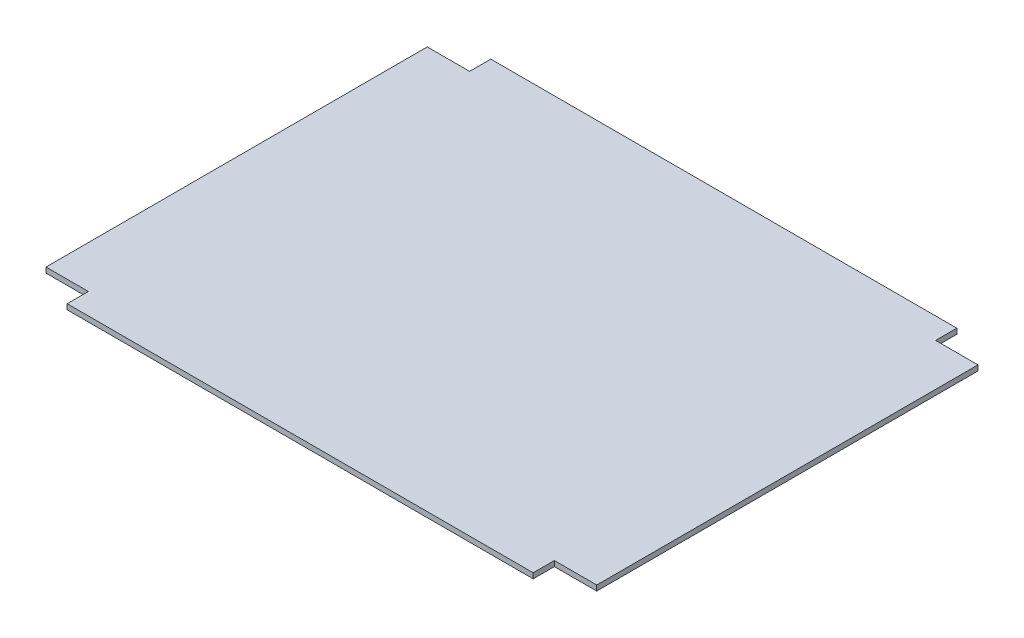
ISO-10303-21;
HEADER;
FILE_DESCRIPTION(('STEP AP214'),'2;1');
FILE_NAME('part.step','',(''),(''),'','','');
FILE_SCHEMA(('AUTOMOTIVE_DESIGN { 1 0 10303 214 1 1 1 1 }'));
ENDSEC;
DATA;
#1=APPLICATION_CONTEXT('core data for automotive mechanical design processes');
#2=APPLICATION_PROTOCOL_DEFINITION('international standard','automotive_design',2000,#1);
#3=PRODUCT_CONTEXT('',#1,'mechanical');
#4=PRODUCT('Part','Part','',(#3));
#5=PRODUCT_RELATED_PRODUCT_CATEGORY('part','',(#4));
#6=PRODUCT_DEFINITION_FORMATION('','',#4);
#7=PRODUCT_DEFINITION_CONTEXT('part definition',#1,'design');
#8=PRODUCT_DEFINITION('design','',#6,#7);
#9=PRODUCT_DEFINITION_SHAPE('','',#8);
#10=(LENGTH_UNIT() NAMED_UNIT(*) SI_UNIT(.MILLI.,.METRE.));
#11=(NAMED_UNIT(*) PLANE_ANGLE_UNIT() SI_UNIT($,.RADIAN.));
#12=(NAMED_UNIT(*) SI_UNIT($,.STERADIAN.) SOLID_ANGLE_UNIT());
#13=UNCERTAINTY_MEASURE_WITH_UNIT(LENGTH_MEASURE(1.E-05),#10,'distance_accuracy_value','');
#14=(GEOMETRIC_REPRESENTATION_CONTEXT(3) GLOBAL_UNCERTAINTY_ASSIGNED_CONTEXT((#13)) GLOBAL_UNIT_ASSIGNED_CONTEXT((#10,
#11,#12)) REPRESENTATION_CONTEXT('',''));
#15=CARTESIAN_POINT('',(0.,0.,0.));
#16=DIRECTION('',(0.,0.,1.));
#17=DIRECTION('',(1.,0.,0.));
#18=AXIS2_PLACEMENT_3D('',#15,#16,#17);
#19=CARTESIAN_POINT('',(-520.,10.,360.));
#20=DIRECTION('',(1.,0.,0.));
#21=DIRECTION('',(0.,0.,-1.));
#22=AXIS2_PLACEMENT_3D('',#19,#20,#21);
#23=PLANE('',#22);
#24=DIRECTION('',(0.,0.,1.));
#25=VECTOR('',#24,1.);
#26=CARTESIAN_POINT('',(-520.,0.,360.));
#27=LINE('',#26,#25);
#28=CARTESIAN_POINT('',(-520.,0.,-360.));
#29=VERTEX_POINT('',#28);
#30=CARTESIAN_POINT('',(-520.,0.,360.));
#31=VERTEX_POINT('',#30);
#32=EDGE_CURVE('E208',#29,#31,#27,.T.);
#33=ORIENTED_EDGE('',*,*,#32,.T.);
#34=DIRECTION('',(0.,-1.,0.));
#35=VECTOR('',#34,1.);
#36=CARTESIAN_POINT('',(-520.,10.,360.));
#37=LINE('',#36,#35);
#38=CARTESIAN_POINT('',(-520.,10.,360.));
#39=VERTEX_POINT('',#38);
#40=EDGE_CURVE('E11',#39,#31,#37,.T.);
#41=ORIENTED_EDGE('',*,*,#40,.F.);
#42=DIRECTION('',(0.,0.,1.));
#43=VECTOR('',#42,1.);
#44=CARTESIAN_POINT('',(-520.,10.,360.));
#45=LINE('',#44,#43);
#46=CARTESIAN_POINT('',(-520.,10.,-360.));
#47=VERTEX_POINT('',#46);
#48=EDGE_CURVE('E73',#47,#39,#45,.T.);
#49=ORIENTED_EDGE('',*,*,#48,.F.);
#50=DIRECTION('',(0.,-1.,0.));
#51=VECTOR('',#50,1.);
#52=CARTESIAN_POINT('',(-520.,10.,-360.));
#53=LINE('',#52,#51);
#54=EDGE_CURVE('E195',#47,#29,#53,.T.);
#55=ORIENTED_EDGE('',*,*,#54,.T.);
#56=EDGE_LOOP('',(#33,#41,#49,#55));
#57=FACE_BOUND('',#56,.T.);
#58=ADVANCED_FACE('F33',(#57),#23,.F.);
#59=CARTESIAN_POINT('',(-440.,10.,360.));
#60=DIRECTION('',(0.,0.,-1.));
#61=DIRECTION('',(-1.,0.,0.));
#62=AXIS2_PLACEMENT_3D('',#59,#60,#61);
#63=PLANE('',#62);
#64=DIRECTION('',(1.,0.,0.));
#65=VECTOR('',#64,1.);
#66=CARTESIAN_POINT('',(-440.,0.,360.));
#67=LINE('',#66,#65);
#68=CARTESIAN_POINT('',(-440.,0.,360.));
#69=VERTEX_POINT('',#68);
#70=EDGE_CURVE('E63',#31,#69,#67,.T.);
#71=ORIENTED_EDGE('',*,*,#70,.T.);
#72=DIRECTION('',(0.,-1.,0.));
#73=VECTOR('',#72,1.);
#74=CARTESIAN_POINT('',(-440.,10.,360.));
#75=LINE('',#74,#73);
#76=CARTESIAN_POINT('',(-440.,10.,360.));
#77=VERTEX_POINT('',#76);
#78=EDGE_CURVE('E41',#77,#69,#75,.T.);
#79=ORIENTED_EDGE('',*,*,#78,.F.);
#80=DIRECTION('',(1.,0.,0.));
#81=VECTOR('',#80,1.);
#82=CARTESIAN_POINT('',(-440.,10.,360.));
#83=LINE('',#82,#81);
#84=EDGE_CURVE('E210',#39,#77,#83,.T.);
#85=ORIENTED_EDGE('',*,*,#84,.F.);
#86=ORIENTED_EDGE('',*,*,#40,.T.);
#87=EDGE_LOOP('',(#71,#79,#85,#86));
#88=FACE_BOUND('',#87,.T.);
#89=ADVANCED_FACE('F250',(#88),#63,.F.);
#90=CARTESIAN_POINT('',(-440.,10.,400.));
#91=DIRECTION('',(1.,0.,0.));
#92=DIRECTION('',(0.,0.,-1.));
#93=AXIS2_PLACEMENT_3D('',#90,#91,#92);
#94=PLANE('',#93);
#95=DIRECTION('',(0.,0.,1.));
#96=VECTOR('',#95,1.);
#97=CARTESIAN_POINT('',(-440.,0.,400.));
#98=LINE('',#97,#96);
#99=CARTESIAN_POINT('',(-440.,0.,400.));
#100=VERTEX_POINT('',#99);
#101=EDGE_CURVE('E68',#69,#100,#98,.T.);
#102=ORIENTED_EDGE('',*,*,#101,.T.);
#103=DIRECTION('',(0.,-1.,0.));
#104=VECTOR('',#103,1.);
#105=CARTESIAN_POINT('',(-440.,10.,400.));
#106=LINE('',#105,#104);
#107=CARTESIAN_POINT('',(-440.,10.,400.));
#108=VERTEX_POINT('',#107);
#109=EDGE_CURVE('E136',#108,#100,#106,.T.);
#110=ORIENTED_EDGE('',*,*,#109,.F.);
#111=DIRECTION('',(0.,0.,1.));
#112=VECTOR('',#111,1.);
#113=CARTESIAN_POINT('',(-440.,10.,400.));
#114=LINE('',#113,#112);
#115=EDGE_CURVE('E49',#77,#108,#114,.T.);
#116=ORIENTED_EDGE('',*,*,#115,.F.);
#117=ORIENTED_EDGE('',*,*,#78,.T.);
#118=EDGE_LOOP('',(#102,#110,#116,#117));
#119=FACE_BOUND('',#118,.T.);
#120=ADVANCED_FACE('F217',(#119),#94,.F.);
#121=CARTESIAN_POINT('',(0.,10.,400.));
#122=DIRECTION('',(0.,0.,-1.));
#123=DIRECTION('',(-1.,0.,0.));
#124=AXIS2_PLACEMENT_3D('',#121,#122,#123);
#125=PLANE('',#124);
#126=DIRECTION('',(1.,0.,0.));
#127=VECTOR('',#126,1.);
#128=CARTESIAN_POINT('',(0.,0.,400.));
#129=LINE('',#128,#127);
#130=CARTESIAN_POINT('',(440.,0.,400.));
#131=VERTEX_POINT('',#130);
#132=EDGE_CURVE('E142',#100,#131,#129,.T.);
#133=ORIENTED_EDGE('',*,*,#132,.T.);
#134=DIRECTION('',(0.,-1.,0.));
#135=VECTOR('',#134,1.);
#136=CARTESIAN_POINT('',(440.,10.,400.));
#137=LINE('',#136,#135);
#138=CARTESIAN_POINT('',(440.,10.,400.));
#139=VERTEX_POINT('',#138);
#140=EDGE_CURVE('E139',#139,#131,#137,.T.);
#141=ORIENTED_EDGE('',*,*,#140,.F.);
#142=DIRECTION('',(1.,0.,0.));
#143=VECTOR('',#142,1.);
#144=CARTESIAN_POINT('',(0.,10.,400.));
#145=LINE('',#144,#143);
#146=EDGE_CURVE('E128',#108,#139,#145,.T.);
#147=ORIENTED_EDGE('',*,*,#146,.F.);
#148=ORIENTED_EDGE('',*,*,#109,.T.);
#149=EDGE_LOOP('',(#133,#141,#147,#148));
#150=FACE_BOUND('',#149,.T.);
#151=ADVANCED_FACE('F140',(#150),#125,.F.);
#152=CARTESIAN_POINT('',(0.,10.,0.));
#153=DIRECTION('',(0.,-1.,0.));
#154=DIRECTION('',(0.,0.,-1.));
#155=AXIS2_PLACEMENT_3D('',#152,#153,#154);
#156=PLANE('',#155);
#157=ORIENTED_EDGE('',*,*,#146,.T.);
#158=DIRECTION('',(0.,0.,1.));
#159=VECTOR('',#158,1.);
#160=CARTESIAN_POINT('',(440.,10.,400.));
#161=LINE('',#160,#159);
#162=CARTESIAN_POINT('',(440.,10.,360.));
#163=VERTEX_POINT('',#162);
#164=EDGE_CURVE('E133',#163,#139,#161,.T.);
#165=ORIENTED_EDGE('',*,*,#164,.F.);
#166=DIRECTION('',(-1.,0.,0.));
#167=VECTOR('',#166,1.);
#168=CARTESIAN_POINT('',(440.,10.,360.));
#169=LINE('',#168,#167);
#170=CARTESIAN_POINT('',(520.,10.,360.));
#171=VERTEX_POINT('',#170);
#172=EDGE_CURVE('E150',#171,#163,#169,.T.);
#173=ORIENTED_EDGE('',*,*,#172,.F.);
#174=DIRECTION('',(0.,0.,-1.));
#175=VECTOR('',#174,1.);
#176=CARTESIAN_POINT('',(520.,10.,-360.));
#177=LINE('',#176,#175);
#178=CARTESIAN_POINT('',(520.,10.,-360.));
#179=VERTEX_POINT('',#178);
#180=EDGE_CURVE('E163',#171,#179,#177,.T.);
#181=ORIENTED_EDGE('',*,*,#180,.T.);
#182=DIRECTION('',(-1.,0.,0.));
#183=VECTOR('',#182,1.);
#184=CARTESIAN_POINT('',(440.,10.,-360.));
#185=LINE('',#184,#183);
#186=CARTESIAN_POINT('',(440.,10.,-360.));
#187=VERTEX_POINT('',#186);
#188=EDGE_CURVE('E165',#179,#187,#185,.T.);
#189=ORIENTED_EDGE('',*,*,#188,.T.);
#190=DIRECTION('',(0.,0.,-1.));
#191=VECTOR('',#190,1.);
#192=CARTESIAN_POINT('',(440.,10.,-400.));
#193=LINE('',#192,#191);
#194=CARTESIAN_POINT('',(440.,10.,-400.));
#195=VERTEX_POINT('',#194);
#196=EDGE_CURVE('E168',#187,#195,#193,.T.);
#197=ORIENTED_EDGE('',*,*,#196,.T.);
#198=DIRECTION('',(1.,0.,0.));
#199=VECTOR('',#198,1.);
#200=CARTESIAN_POINT('',(0.,10.,-400.));
#201=LINE('',#200,#199);
#202=CARTESIAN_POINT('',(-440.,10.,-400.));
#203=VERTEX_POINT('',#202);
#204=EDGE_CURVE('E186',#203,#195,#201,.T.);
#205=ORIENTED_EDGE('',*,*,#204,.F.);
#206=DIRECTION('',(0.,0.,-1.));
#207=VECTOR('',#206,1.);
#208=CARTESIAN_POINT('',(-440.,10.,-400.));
#209=LINE('',#208,#207);
#210=CARTESIAN_POINT('',(-440.,10.,-360.));
#211=VERTEX_POINT('',#210);
#212=EDGE_CURVE('E188',#211,#203,#209,.T.);
#213=ORIENTED_EDGE('',*,*,#212,.F.);
#214=DIRECTION('',(1.,0.,0.));
#215=VECTOR('',#214,1.);
#216=CARTESIAN_POINT('',(-440.,10.,-360.));
#217=LINE('',#216,#215);
#218=EDGE_CURVE('E192',#47,#211,#217,.T.);
#219=ORIENTED_EDGE('',*,*,#218,.F.);
#220=ORIENTED_EDGE('',*,*,#48,.T.);
#221=ORIENTED_EDGE('',*,*,#84,.T.);
#222=ORIENTED_EDGE('',*,*,#115,.T.);
#223=EDGE_LOOP('',(#157,#165,#173,#181,#189,#197,#205,#213,#219,#220,#221,#222));
#224=FACE_BOUND('',#223,.T.);
#225=ADVANCED_FACE('F130',(#224),#156,.F.);
#226=CARTESIAN_POINT('',(0.,0.,0.));
#227=DIRECTION('',(0.,-1.,0.));
#228=DIRECTION('',(0.,0.,-1.));
#229=AXIS2_PLACEMENT_3D('',#226,#227,#228);
#230=PLANE('',#229);
#231=ORIENTED_EDGE('',*,*,#32,.F.);
#232=DIRECTION('',(1.,0.,0.));
#233=VECTOR('',#232,1.);
#234=CARTESIAN_POINT('',(-440.,0.,-360.));
#235=LINE('',#234,#233);
#236=CARTESIAN_POINT('',(-440.,0.,-360.));
#237=VERTEX_POINT('',#236);
#238=EDGE_CURVE('E189',#29,#237,#235,.T.);
#239=ORIENTED_EDGE('',*,*,#238,.T.);
#240=DIRECTION('',(0.,0.,-1.));
#241=VECTOR('',#240,1.);
#242=CARTESIAN_POINT('',(-440.,0.,-400.));
#243=LINE('',#242,#241);
#244=CARTESIAN_POINT('',(-440.,0.,-400.));
#245=VERTEX_POINT('',#244);
#246=EDGE_CURVE('E197',#237,#245,#243,.T.);
#247=ORIENTED_EDGE('',*,*,#246,.T.);
#248=DIRECTION('',(1.,0.,0.));
#249=VECTOR('',#248,1.);
#250=CARTESIAN_POINT('',(0.,0.,-400.));
#251=LINE('',#250,#249);
#252=CARTESIAN_POINT('',(440.,0.,-400.));
#253=VERTEX_POINT('',#252);
#254=EDGE_CURVE('E185',#245,#253,#251,.T.);
#255=ORIENTED_EDGE('',*,*,#254,.T.);
#256=DIRECTION('',(0.,0.,-1.));
#257=VECTOR('',#256,1.);
#258=CARTESIAN_POINT('',(440.,0.,-400.));
#259=LINE('',#258,#257);
#260=CARTESIAN_POINT('',(440.,0.,-360.));
#261=VERTEX_POINT('',#260);
#262=EDGE_CURVE('E166',#261,#253,#259,.T.);
#263=ORIENTED_EDGE('',*,*,#262,.F.);
#264=DIRECTION('',(-1.,0.,0.));
#265=VECTOR('',#264,1.);
#266=CARTESIAN_POINT('',(440.,0.,-360.));
#267=LINE('',#266,#265);
#268=CARTESIAN_POINT('',(520.,0.,-360.));
#269=VERTEX_POINT('',#268);
#270=EDGE_CURVE('E173',#269,#261,#267,.T.);
#271=ORIENTED_EDGE('',*,*,#270,.F.);
#272=DIRECTION('',(0.,0.,-1.));
#273=VECTOR('',#272,1.);
#274=CARTESIAN_POINT('',(520.,0.,-360.));
#275=LINE('',#274,#273);
#276=CARTESIAN_POINT('',(520.,0.,360.));
#277=VERTEX_POINT('',#276);
#278=EDGE_CURVE('E146',#277,#269,#275,.T.);
#279=ORIENTED_EDGE('',*,*,#278,.F.);
#280=DIRECTION('',(-1.,0.,0.));
#281=VECTOR('',#280,1.);
#282=CARTESIAN_POINT('',(440.,0.,360.));
#283=LINE('',#282,#281);
#284=CARTESIAN_POINT('',(440.,0.,360.));
#285=VERTEX_POINT('',#284);
#286=EDGE_CURVE('E151',#277,#285,#283,.T.);
#287=ORIENTED_EDGE('',*,*,#286,.T.);
#288=DIRECTION('',(0.,0.,1.));
#289=VECTOR('',#288,1.);
#290=CARTESIAN_POINT('',(440.,0.,400.));
#291=LINE('',#290,#289);
#292=EDGE_CURVE('E156',#285,#131,#291,.T.);
#293=ORIENTED_EDGE('',*,*,#292,.T.);
#294=ORIENTED_EDGE('',*,*,#132,.F.);
#295=ORIENTED_EDGE('',*,*,#101,.F.);
#296=ORIENTED_EDGE('',*,*,#70,.F.);
#297=EDGE_LOOP('',(#231,#239,#247,#255,#263,#271,#279,#287,#293,#294,#295,#296));
#298=FACE_BOUND('',#297,.T.);
#299=ADVANCED_FACE('F220',(#298),#230,.T.);
#300=CARTESIAN_POINT('',(0.,10.,-400.));
#301=DIRECTION('',(0.,0.,-1.));
#302=DIRECTION('',(-1.,0.,0.));
#303=AXIS2_PLACEMENT_3D('',#300,#301,#302);
#304=PLANE('',#303);
#305=ORIENTED_EDGE('',*,*,#254,.F.);
#306=DIRECTION('',(0.,-1.,0.));
#307=VECTOR('',#306,1.);
#308=CARTESIAN_POINT('',(-440.,10.,-400.));
#309=LINE('',#308,#307);
#310=EDGE_CURVE('E206',#203,#245,#309,.T.);
#311=ORIENTED_EDGE('',*,*,#310,.F.);
#312=ORIENTED_EDGE('',*,*,#204,.T.);
#313=DIRECTION('',(0.,-1.,0.));
#314=VECTOR('',#313,1.);
#315=CARTESIAN_POINT('',(440.,10.,-400.));
#316=LINE('',#315,#314);
#317=EDGE_CURVE('E171',#195,#253,#316,.T.);
#318=ORIENTED_EDGE('',*,*,#317,.T.);
#319=EDGE_LOOP('',(#305,#311,#312,#318));
#320=FACE_BOUND('',#319,.T.);
#321=ADVANCED_FACE('F262',(#320),#304,.T.);
#322=CARTESIAN_POINT('',(-440.,10.,-400.));
#323=DIRECTION('',(-1.,0.,0.));
#324=DIRECTION('',(0.,0.,1.));
#325=AXIS2_PLACEMENT_3D('',#322,#323,#324);
#326=PLANE('',#325);
#327=ORIENTED_EDGE('',*,*,#246,.F.);
#328=DIRECTION('',(0.,-1.,0.));
#329=VECTOR('',#328,1.);
#330=CARTESIAN_POINT('',(-440.,10.,-360.));
#331=LINE('',#330,#329);
#332=EDGE_CURVE('E204',#211,#237,#331,.T.);
#333=ORIENTED_EDGE('',*,*,#332,.F.);
#334=ORIENTED_EDGE('',*,*,#212,.T.);
#335=ORIENTED_EDGE('',*,*,#310,.T.);
#336=EDGE_LOOP('',(#327,#333,#334,#335));
#337=FACE_BOUND('',#336,.T.);
#338=ADVANCED_FACE('F243',(#337),#326,.T.);
#339=CARTESIAN_POINT('',(-440.,10.,-360.));
#340=DIRECTION('',(0.,0.,-1.));
#341=DIRECTION('',(-1.,0.,0.));
#342=AXIS2_PLACEMENT_3D('',#339,#340,#341);
#343=PLANE('',#342);
#344=ORIENTED_EDGE('',*,*,#238,.F.);
#345=ORIENTED_EDGE('',*,*,#54,.F.);
#346=ORIENTED_EDGE('',*,*,#218,.T.);
#347=ORIENTED_EDGE('',*,*,#332,.T.);
#348=EDGE_LOOP('',(#344,#345,#346,#347));
#349=FACE_BOUND('',#348,.T.);
#350=ADVANCED_FACE('F247',(#349),#343,.T.);
#351=CARTESIAN_POINT('',(520.,10.,-360.));
#352=DIRECTION('',(-1.,0.,0.));
#353=DIRECTION('',(0.,0.,1.));
#354=AXIS2_PLACEMENT_3D('',#351,#352,#353);
#355=PLANE('',#354);
#356=ORIENTED_EDGE('',*,*,#278,.T.);
#357=DIRECTION('',(0.,-1.,0.));
#358=VECTOR('',#357,1.);
#359=CARTESIAN_POINT('',(520.,10.,-360.));
#360=LINE('',#359,#358);
#361=EDGE_CURVE('E182',#179,#269,#360,.T.);
#362=ORIENTED_EDGE('',*,*,#361,.F.);
#363=ORIENTED_EDGE('',*,*,#180,.F.);
#364=DIRECTION('',(0.,-1.,0.));
#365=VECTOR('',#364,1.);
#366=CARTESIAN_POINT('',(520.,10.,360.));
#367=LINE('',#366,#365);
#368=EDGE_CURVE('E153',#171,#277,#367,.T.);
#369=ORIENTED_EDGE('',*,*,#368,.T.);
#370=EDGE_LOOP('',(#356,#362,#363,#369));
#371=FACE_BOUND('',#370,.T.);
#372=ADVANCED_FACE('F230',(#371),#355,.F.);
#373=CARTESIAN_POINT('',(440.,10.,-360.));
#374=DIRECTION('',(0.,0.,1.));
#375=DIRECTION('',(1.,0.,0.));
#376=AXIS2_PLACEMENT_3D('',#373,#374,#375);
#377=PLANE('',#376);
#378=ORIENTED_EDGE('',*,*,#270,.T.);
#379=DIRECTION('',(0.,-1.,0.));
#380=VECTOR('',#379,1.);
#381=CARTESIAN_POINT('',(440.,10.,-360.));
#382=LINE('',#381,#380);
#383=EDGE_CURVE('E179',#187,#261,#382,.T.);
#384=ORIENTED_EDGE('',*,*,#383,.F.);
#385=ORIENTED_EDGE('',*,*,#188,.F.);
#386=ORIENTED_EDGE('',*,*,#361,.T.);
#387=EDGE_LOOP('',(#378,#384,#385,#386));
#388=FACE_BOUND('',#387,.T.);
#389=ADVANCED_FACE('F232',(#388),#377,.F.);
#390=CARTESIAN_POINT('',(440.,10.,-400.));
#391=DIRECTION('',(-1.,0.,0.));
#392=DIRECTION('',(0.,0.,1.));
#393=AXIS2_PLACEMENT_3D('',#390,#391,#392);
#394=PLANE('',#393);
#395=ORIENTED_EDGE('',*,*,#262,.T.);
#396=ORIENTED_EDGE('',*,*,#317,.F.);
#397=ORIENTED_EDGE('',*,*,#196,.F.);
#398=ORIENTED_EDGE('',*,*,#383,.T.);
#399=EDGE_LOOP('',(#395,#396,#397,#398));
#400=FACE_BOUND('',#399,.T.);
#401=ADVANCED_FACE('F237',(#400),#394,.F.);
#402=CARTESIAN_POINT('',(440.,10.,400.));
#403=DIRECTION('',(1.,0.,0.));
#404=DIRECTION('',(0.,0.,-1.));
#405=AXIS2_PLACEMENT_3D('',#402,#403,#404);
#406=PLANE('',#405);
#407=ORIENTED_EDGE('',*,*,#292,.F.);
#408=DIRECTION('',(0.,-1.,0.));
#409=VECTOR('',#408,1.);
#410=CARTESIAN_POINT('',(440.,10.,360.));
#411=LINE('',#410,#409);
#412=EDGE_CURVE('E147',#163,#285,#411,.T.);
#413=ORIENTED_EDGE('',*,*,#412,.F.);
#414=ORIENTED_EDGE('',*,*,#164,.T.);
#415=ORIENTED_EDGE('',*,*,#140,.T.);
#416=EDGE_LOOP('',(#407,#413,#414,#415));
#417=FACE_BOUND('',#416,.T.);
#418=ADVANCED_FACE('F149',(#417),#406,.T.);
#419=CARTESIAN_POINT('',(440.,10.,360.));
#420=DIRECTION('',(0.,0.,1.));
#421=DIRECTION('',(1.,0.,0.));
#422=AXIS2_PLACEMENT_3D('',#419,#420,#421);
#423=PLANE('',#422);
#424=ORIENTED_EDGE('',*,*,#286,.F.);
#425=ORIENTED_EDGE('',*,*,#368,.F.);
#426=ORIENTED_EDGE('',*,*,#172,.T.);
#427=ORIENTED_EDGE('',*,*,#412,.T.);
#428=EDGE_LOOP('',(#424,#425,#426,#427));
#429=FACE_BOUND('',#428,.T.);
#430=ADVANCED_FACE('F225',(#429),#423,.T.);
#431=CLOSED_SHELL('',(#58,#89,#120,#151,#225,#299,#321,#338,#350,#372,#389,#401,#418,#430));
#432=MANIFOLD_SOLID_BREP('B2',#431);
#433=ADVANCED_BREP_SHAPE_REPRESENTATION('',(#18,#432),#14);
#434=SHAPE_DEFINITION_REPRESENTATION(#9,#433);
ENDSEC;
END-ISO-10303-21;
